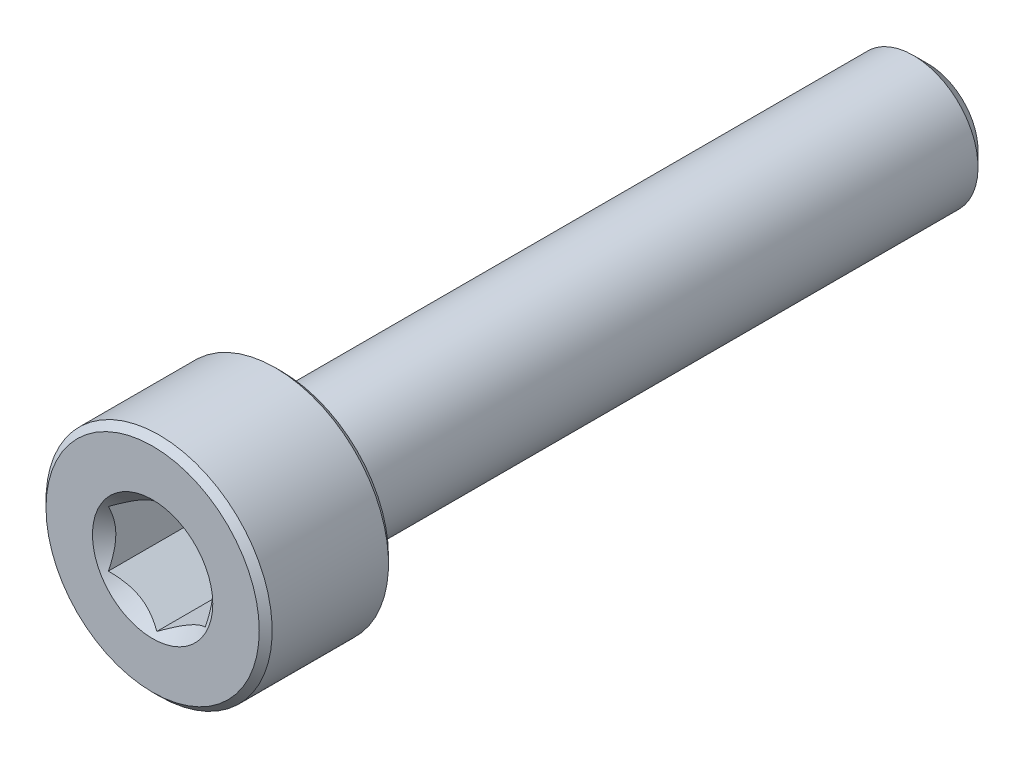
ISO-10303-21;
HEADER;
FILE_DESCRIPTION(('STEP AP214'),'2;1');
FILE_NAME('part.step','',(''),(''),'','','');
FILE_SCHEMA(('AUTOMOTIVE_DESIGN { 1 0 10303 214 1 1 1 1 }'));
ENDSEC;
DATA;
#1=APPLICATION_CONTEXT('core data for automotive mechanical design processes');
#2=APPLICATION_PROTOCOL_DEFINITION('international standard','automotive_design',2000,#1);
#3=PRODUCT_CONTEXT('',#1,'mechanical');
#4=PRODUCT('Part','Part','',(#3));
#5=PRODUCT_RELATED_PRODUCT_CATEGORY('part','',(#4));
#6=PRODUCT_DEFINITION_FORMATION('','',#4);
#7=PRODUCT_DEFINITION_CONTEXT('part definition',#1,'design');
#8=PRODUCT_DEFINITION('design','',#6,#7);
#9=PRODUCT_DEFINITION_SHAPE('','',#8);
#10=(LENGTH_UNIT() NAMED_UNIT(*) SI_UNIT(.MILLI.,.METRE.));
#11=(NAMED_UNIT(*) PLANE_ANGLE_UNIT() SI_UNIT($,.RADIAN.));
#12=(NAMED_UNIT(*) SI_UNIT($,.STERADIAN.) SOLID_ANGLE_UNIT());
#13=UNCERTAINTY_MEASURE_WITH_UNIT(LENGTH_MEASURE(1.E-05),#10,'distance_accuracy_value','');
#14=(GEOMETRIC_REPRESENTATION_CONTEXT(3) GLOBAL_UNCERTAINTY_ASSIGNED_CONTEXT((#13)) GLOBAL_UNIT_ASSIGNED_CONTEXT((#10,
#11,#12)) REPRESENTATION_CONTEXT('',''));
#15=CARTESIAN_POINT('',(0.,0.,0.));
#16=DIRECTION('',(0.,0.,1.));
#17=DIRECTION('',(1.,0.,0.));
#18=AXIS2_PLACEMENT_3D('',#15,#16,#17);
#19=CARTESIAN_POINT('',(0.,1.54533666301317,-12.));
#20=DIRECTION('',(0.,0.,-1.));
#21=DIRECTION('',(0.,1.,0.));
#22=AXIS2_PLACEMENT_3D('',#19,#20,#21);
#23=PLANE('',#22);
#24=CARTESIAN_POINT('',(0.,0.,-12.));
#25=DIRECTION('',(0.,0.,-1.));
#26=DIRECTION('',(0.,1.,0.));
#27=AXIS2_PLACEMENT_3D('',#24,#25,#26);
#28=CIRCLE('',#27,1.54533666301317);
#29=CARTESIAN_POINT('',(0.,1.54533666301317,-12.));
#30=VERTEX_POINT('',#29);
#31=EDGE_CURVE('E52',#30,#30,#28,.T.);
#32=ORIENTED_EDGE('',*,*,#31,.T.);
#33=EDGE_LOOP('',(#32));
#34=FACE_BOUND('',#33,.T.);
#35=ADVANCED_FACE('F39',(#34),#23,.T.);
#36=CARTESIAN_POINT('',(0.,0.,-12.));
#37=DIRECTION('',(0.,0.,1.));
#38=DIRECTION('',(0.,-1.,0.));
#39=AXIS2_PLACEMENT_3D('',#36,#37,#38);
#40=CONICAL_SURFACE('',#39,1.54533666301317,0.785398163397447);
#41=CARTESIAN_POINT('',(0.,0.,-11.5453366630132));
#42=DIRECTION('',(0.,0.,-1.));
#43=DIRECTION('',(0.,1.,0.));
#44=AXIS2_PLACEMENT_3D('',#41,#42,#43);
#45=CIRCLE('',#44,2.);
#46=CARTESIAN_POINT('',(0.,2.,-11.5453366630132));
#47=VERTEX_POINT('',#46);
#48=EDGE_CURVE('E155',#47,#47,#45,.T.);
#49=ORIENTED_EDGE('',*,*,#48,.T.);
#50=EDGE_LOOP('',(#49));
#51=FACE_BOUND('',#50,.T.);
#52=ORIENTED_EDGE('',*,*,#31,.F.);
#53=EDGE_LOOP('',(#52));
#54=FACE_BOUND('',#53,.T.);
#55=ADVANCED_FACE('F161',(#51,#54),#40,.T.);
#56=CARTESIAN_POINT('',(0.,0.,-12.));
#57=DIRECTION('',(0.,0.,-1.));
#58=DIRECTION('',(0.,1.,0.));
#59=AXIS2_PLACEMENT_3D('',#56,#57,#58);
#60=CYLINDRICAL_SURFACE('',#59,2.);
#61=CARTESIAN_POINT('',(0.,0.,7.8));
#62=DIRECTION('',(0.,0.,-1.));
#63=DIRECTION('',(0.,1.,0.));
#64=AXIS2_PLACEMENT_3D('',#61,#62,#63);
#65=CIRCLE('',#64,2.);
#66=CARTESIAN_POINT('',(0.,2.,7.8));
#67=VERTEX_POINT('',#66);
#68=EDGE_CURVE('E152',#67,#67,#65,.T.);
#69=ORIENTED_EDGE('',*,*,#68,.T.);
#70=EDGE_LOOP('',(#69));
#71=FACE_BOUND('',#70,.T.);
#72=ORIENTED_EDGE('',*,*,#48,.F.);
#73=EDGE_LOOP('',(#72));
#74=FACE_BOUND('',#73,.T.);
#75=ADVANCED_FACE('F163',(#71,#74),#60,.T.);
#76=CARTESIAN_POINT('',(0.,0.,7.8));
#77=DIRECTION('',(0.,0.,-1.));
#78=DIRECTION('',(0.,1.,0.));
#79=AXIS2_PLACEMENT_3D('',#76,#77,#78);
#80=TOROIDAL_SURFACE('',#79,2.2,0.2);
#81=CARTESIAN_POINT('',(0.,0.,8.));
#82=DIRECTION('',(0.,0.,-1.));
#83=DIRECTION('',(0.,1.,0.));
#84=AXIS2_PLACEMENT_3D('',#81,#82,#83);
#85=CIRCLE('',#84,2.2);
#86=CARTESIAN_POINT('',(0.,2.2,8.));
#87=VERTEX_POINT('',#86);
#88=EDGE_CURVE('E149',#87,#87,#85,.T.);
#89=ORIENTED_EDGE('',*,*,#88,.T.);
#90=EDGE_LOOP('',(#89));
#91=FACE_BOUND('',#90,.T.);
#92=ORIENTED_EDGE('',*,*,#68,.F.);
#93=EDGE_LOOP('',(#92));
#94=FACE_BOUND('',#93,.T.);
#95=ADVANCED_FACE('F169',(#91,#94),#80,.F.);
#96=CARTESIAN_POINT('',(0.,3.3,8.));
#97=DIRECTION('',(0.,0.,-1.));
#98=DIRECTION('',(0.,1.,0.));
#99=AXIS2_PLACEMENT_3D('',#96,#97,#98);
#100=PLANE('',#99);
#101=CARTESIAN_POINT('',(0.,0.,8.));
#102=DIRECTION('',(0.,0.,-1.));
#103=DIRECTION('',(0.,1.,0.));
#104=AXIS2_PLACEMENT_3D('',#101,#102,#103);
#105=CIRCLE('',#104,3.3);
#106=CARTESIAN_POINT('',(0.,3.3,8.));
#107=VERTEX_POINT('',#106);
#108=EDGE_CURVE('E146',#107,#107,#105,.T.);
#109=ORIENTED_EDGE('',*,*,#108,.T.);
#110=EDGE_LOOP('',(#109));
#111=FACE_BOUND('',#110,.T.);
#112=ORIENTED_EDGE('',*,*,#88,.F.);
#113=EDGE_LOOP('',(#112));
#114=FACE_BOUND('',#113,.T.);
#115=ADVANCED_FACE('F175',(#111,#114),#100,.T.);
#116=CARTESIAN_POINT('',(0.,0.,8.));
#117=DIRECTION('',(0.,0.,1.));
#118=DIRECTION('',(0.,-1.,0.));
#119=AXIS2_PLACEMENT_3D('',#116,#117,#118);
#120=CONICAL_SURFACE('',#119,3.3,0.785398163397443);
#121=CARTESIAN_POINT('',(0.,0.,8.2));
#122=DIRECTION('',(0.,0.,-1.));
#123=DIRECTION('',(0.,1.,0.));
#124=AXIS2_PLACEMENT_3D('',#121,#122,#123);
#125=CIRCLE('',#124,3.5);
#126=CARTESIAN_POINT('',(0.,3.5,8.2));
#127=VERTEX_POINT('',#126);
#128=EDGE_CURVE('E143',#127,#127,#125,.T.);
#129=ORIENTED_EDGE('',*,*,#128,.T.);
#130=EDGE_LOOP('',(#129));
#131=FACE_BOUND('',#130,.T.);
#132=ORIENTED_EDGE('',*,*,#108,.F.);
#133=EDGE_LOOP('',(#132));
#134=FACE_BOUND('',#133,.T.);
#135=ADVANCED_FACE('F179',(#131,#134),#120,.T.);
#136=CARTESIAN_POINT('',(0.,0.,-12.));
#137=DIRECTION('',(0.,0.,-1.));
#138=DIRECTION('',(0.,1.,0.));
#139=AXIS2_PLACEMENT_3D('',#136,#137,#138);
#140=CYLINDRICAL_SURFACE('',#139,3.5);
#141=CARTESIAN_POINT('',(0.,0.,11.8));
#142=DIRECTION('',(0.,0.,-1.));
#143=DIRECTION('',(0.,1.,0.));
#144=AXIS2_PLACEMENT_3D('',#141,#142,#143);
#145=CIRCLE('',#144,3.5);
#146=CARTESIAN_POINT('',(0.,3.5,11.8));
#147=VERTEX_POINT('',#146);
#148=EDGE_CURVE('E140',#147,#147,#145,.T.);
#149=ORIENTED_EDGE('',*,*,#148,.T.);
#150=EDGE_LOOP('',(#149));
#151=FACE_BOUND('',#150,.T.);
#152=ORIENTED_EDGE('',*,*,#128,.F.);
#153=EDGE_LOOP('',(#152));
#154=FACE_BOUND('',#153,.T.);
#155=ADVANCED_FACE('F183',(#151,#154),#140,.T.);
#156=CARTESIAN_POINT('',(0.,0.,11.8));
#157=DIRECTION('',(0.,0.,-1.));
#158=DIRECTION('',(0.,1.,0.));
#159=AXIS2_PLACEMENT_3D('',#156,#157,#158);
#160=CONICAL_SURFACE('',#159,3.5,0.785398163397452);
#161=CARTESIAN_POINT('',(0.,0.,12.));
#162=DIRECTION('',(0.,0.,-1.));
#163=DIRECTION('',(0.,1.,0.));
#164=AXIS2_PLACEMENT_3D('',#161,#162,#163);
#165=CIRCLE('',#164,3.3);
#166=CARTESIAN_POINT('',(0.,3.3,12.));
#167=VERTEX_POINT('',#166);
#168=EDGE_CURVE('E137',#167,#167,#165,.T.);
#169=ORIENTED_EDGE('',*,*,#168,.T.);
#170=EDGE_LOOP('',(#169));
#171=FACE_BOUND('',#170,.T.);
#172=ORIENTED_EDGE('',*,*,#148,.F.);
#173=EDGE_LOOP('',(#172));
#174=FACE_BOUND('',#173,.T.);
#175=ADVANCED_FACE('F187',(#171,#174),#160,.T.);
#176=CARTESIAN_POINT('',(0.,0.,12.));
#177=DIRECTION('',(0.,0.,1.));
#178=DIRECTION('',(0.,-1.,0.));
#179=AXIS2_PLACEMENT_3D('',#176,#177,#178);
#180=PLANE('',#179);
#181=CARTESIAN_POINT('',(0.,0.,12.));
#182=DIRECTION('',(0.,0.,1.));
#183=DIRECTION('',(1.,0.,0.));
#184=AXIS2_PLACEMENT_3D('',#181,#182,#183);
#185=CIRCLE('',#184,1.86195461813654);
#186=CARTESIAN_POINT('',(1.86195461813654,0.,12.));
#187=VERTEX_POINT('',#186);
#188=EDGE_CURVE('E111',#187,#187,#185,.T.);
#189=ORIENTED_EDGE('',*,*,#188,.F.);
#190=EDGE_LOOP('',(#189));
#191=FACE_BOUND('',#190,.T.);
#192=ORIENTED_EDGE('',*,*,#168,.F.);
#193=EDGE_LOOP('',(#192));
#194=FACE_BOUND('',#193,.T.);
#195=ADVANCED_FACE('F191',(#191,#194),#180,.T.);
#196=CARTESIAN_POINT('',(0.,0.,12.));
#197=DIRECTION('',(0.,0.,1.));
#198=DIRECTION('',(1.,0.,0.));
#199=AXIS2_PLACEMENT_3D('',#196,#197,#198);
#200=CONICAL_SURFACE('',#199,1.86195461813654,0.78539816339745);
#201=ORIENTED_EDGE('',*,*,#188,.T.);
#202=EDGE_LOOP('',(#201));
#203=FACE_BOUND('',#202,.T.);
#204=CARTESIAN_POINT('',(-0.000199999999999267,-1.73216627762272,11.8702116710324));
#205=CARTESIAN_POINT('',(0.0513677907370761,-1.70239359975915,11.8404616654997));
#206=CARTESIAN_POINT('',(0.103797917665201,-1.67212305186355,11.8124586733426));
#207=CARTESIAN_POINT('',(0.210709034055597,-1.61039789003619,11.7611854198725));
#208=CARTESIAN_POINT('',(0.265200195814661,-1.57893740312614,11.7379436944767));
#209=CARTESIAN_POINT('',(0.375079081357248,-1.51549879897987,11.6981299184246));
#210=CARTESIAN_POINT('',(0.4304388090952,-1.4835368452681,11.6814577751032));
#211=CARTESIAN_POINT('',(0.542377257477151,-1.41890915196211,11.6557706462504));
#212=CARTESIAN_POINT('',(0.598952556553009,-1.38624538781118,11.6467364799112));
#213=CARTESIAN_POINT('',(0.696455389516441,-1.32995210095299,11.6385852706592));
#214=CARTESIAN_POINT('',(0.737256908280466,-1.30639533311124,11.6373784424216));
#215=CARTESIAN_POINT('',(0.818787969615858,-1.25932335290193,11.6394102465946));
#216=CARTESIAN_POINT('',(0.85951749431463,-1.23580815085313,11.6426498601806));
#217=CARTESIAN_POINT('',(0.940584402163416,-1.18900414978427,11.6533881754143));
#218=CARTESIAN_POINT('',(0.980921384598288,-1.1657155821172,11.6608908424511));
#219=CARTESIAN_POINT('',(1.06091833691403,-1.11952932016335,11.6797478013606));
#220=CARTESIAN_POINT('',(1.10057800851621,-1.09663179808786,11.6911037464509));
#221=CARTESIAN_POINT('',(1.20216313477448,-1.03798159809698,11.724817837025));
#222=CARTESIAN_POINT('',(1.26345855370969,-1.00259267147465,11.7497180385257));
#223=CARTESIAN_POINT('',(1.35358562846331,-0.950557780604375,11.7917528427039));
#224=CARTESIAN_POINT('',(1.38328513990772,-0.933410759677148,11.8065213429914));
#225=CARTESIAN_POINT('',(1.44213790138375,-0.899432101996407,11.8374067553725));
#226=CARTESIAN_POINT('',(1.47129140422064,-0.88260031928571,11.853523023554));
#227=CARTESIAN_POINT('',(1.5002,-0.865909933730601,11.8702116710324));
#228=B_SPLINE_CURVE_WITH_KNOTS('',3,(#204,#205,#206,#207,#208,#209,#210,#211,#212,#213,#214,
#215,#216,#217,#218,#219,#220,#221,#222,#223,#224,#225,#226,#227),.UNSPECIFIED.,.F.,.F.,(4,2,2,
2,2,2,2,2,2,2,2,4),(0.,0.199829143693304,0.400822987382388,0.59862372053818,0.795926240188888,
0.93711306795988,1.07833105577193,1.21968061668222,1.36109089931054,1.58570969637565,
1.69770705470963,1.80965120737194),.UNSPECIFIED.);
#229=CARTESIAN_POINT('',(0.,-1.73205080756888,11.8700961894323));
#230=VERTEX_POINT('',#229);
#231=CARTESIAN_POINT('',(1.5,-0.866025403784439,11.8700961894323));
#232=VERTEX_POINT('',#231);
#233=EDGE_CURVE('E12',#230,#232,#228,.T.);
#234=ORIENTED_EDGE('',*,*,#233,.F.);
#235=CARTESIAN_POINT('',(-1.5002,-0.865909933730601,11.8702116710324));
#236=CARTESIAN_POINT('',(-1.44863220926292,-0.895682611594166,11.8404616654997));
#237=CARTESIAN_POINT('',(-1.3962020823348,-0.925953159489765,11.8124586733426));
#238=CARTESIAN_POINT('',(-1.2892909659444,-0.987678321317124,11.7611854198725));
#239=CARTESIAN_POINT('',(-1.23479980418534,-1.01913880822717,11.7379436944767));
#240=CARTESIAN_POINT('',(-1.12492091864275,-1.08257741237344,11.6981299184246));
#241=CARTESIAN_POINT('',(-1.0695611909048,-1.11453936608521,11.6814577751032));
#242=CARTESIAN_POINT('',(-0.95762274252285,-1.1791670593912,11.6557706462504));
#243=CARTESIAN_POINT('',(-0.901047443446992,-1.21183082354213,11.6467364799112));
#244=CARTESIAN_POINT('',(-0.80354461048356,-1.26812411040032,11.6385852706592));
#245=CARTESIAN_POINT('',(-0.762743091719534,-1.29168087824208,11.6373784424216));
#246=CARTESIAN_POINT('',(-0.681212030384142,-1.33875285845138,11.6394102465946));
#247=CARTESIAN_POINT('',(-0.640482505685371,-1.36226806050018,11.6426498601806));
#248=CARTESIAN_POINT('',(-0.559415597836584,-1.40907206156905,11.6533881754143));
#249=CARTESIAN_POINT('',(-0.519078615401712,-1.43236062923612,11.6608908424511));
#250=CARTESIAN_POINT('',(-0.439081663085969,-1.47854689118996,11.6797478013606));
#251=CARTESIAN_POINT('',(-0.399421991483792,-1.50144441326545,11.6911037464509));
#252=CARTESIAN_POINT('',(-0.297836865225515,-1.56009461325633,11.724817837025));
#253=CARTESIAN_POINT('',(-0.236541446290311,-1.59548353987866,11.7497180385257));
#254=CARTESIAN_POINT('',(-0.146414371536686,-1.64751843074894,11.7917528427039));
#255=CARTESIAN_POINT('',(-0.116714860092282,-1.66466545167617,11.8065213429914));
#256=CARTESIAN_POINT('',(-0.0578620986162489,-1.69864410935691,11.8374067553725));
#257=CARTESIAN_POINT('',(-0.0287085957793626,-1.71547589206761,11.853523023554));
#258=CARTESIAN_POINT('',(0.000200000000000409,-1.73216627762272,11.8702116710324));
#259=B_SPLINE_CURVE_WITH_KNOTS('',3,(#235,#236,#237,#238,#239,#240,#241,#242,#243,#244,#245,
#246,#247,#248,#249,#250,#251,#252,#253,#254,#255,#256,#257,#258),.UNSPECIFIED.,.F.,.F.,(4,2,2,
2,2,2,2,2,2,2,2,4),(0.,0.199829143693304,0.400822987382388,0.59862372053818,0.795926240188888,
0.93711306795988,1.07833105577193,1.21968061668222,1.36109089931054,1.58570969637565,
1.69770705470964,1.80965120737194),.UNSPECIFIED.);
#260=CARTESIAN_POINT('',(-1.5,-0.866025403784439,11.8700961894323));
#261=VERTEX_POINT('',#260);
#262=EDGE_CURVE('E97',#261,#230,#259,.T.);
#263=ORIENTED_EDGE('',*,*,#262,.F.);
#264=CARTESIAN_POINT('',(-1.5,-1.81798631684901,12.4949658829093));
#265=CARTESIAN_POINT('',(-1.5,-1.77410479833239,12.461123354197));
#266=CARTESIAN_POINT('',(-1.5,-1.72998897047494,12.427585617689));
#267=CARTESIAN_POINT('',(-1.5,-1.64119029432319,12.3612481734927));
#268=CARTESIAN_POINT('',(-1.5,-1.59650731534755,12.328448640911));
#269=CARTESIAN_POINT('',(-1.5,-1.460806940489,12.2308819314804));
#270=CARTESIAN_POINT('',(-1.5,-1.36880251235632,12.1674654206559));
#271=CARTESIAN_POINT('',(-1.5,-1.17526237686872,12.0421023717216));
#272=CARTESIAN_POINT('',(-1.5,-1.07349393006072,11.9805114153672));
#273=CARTESIAN_POINT('',(-1.5,-0.864764842560626,11.8672522059965));
#274=CARTESIAN_POINT('',(-1.5,-0.757823334449948,11.8155504395058));
#275=CARTESIAN_POINT('',(-1.5,-0.598146069886858,11.7522731736164));
#276=CARTESIAN_POINT('',(-1.5,-0.547969945491557,11.7342740839912));
#277=CARTESIAN_POINT('',(-1.5,-0.446326869364775,11.7022954652208));
#278=CARTESIAN_POINT('',(-1.5,-0.394859836419925,11.6883161896624));
#279=CARTESIAN_POINT('',(-1.5,-0.291848397493325,11.6653656903726));
#280=CARTESIAN_POINT('',(-1.5,-0.240324749628771,11.6563028154328));
#281=CARTESIAN_POINT('',(-1.5,-0.13662544851591,11.6433771152152));
#282=CARTESIAN_POINT('',(-1.5,-0.0844499362377799,11.6395131846234));
#283=CARTESIAN_POINT('',(-1.5,0.0176806967011133,11.6373196125689));
#284=CARTESIAN_POINT('',(-1.5,0.0676307045116619,11.6387500692366));
#285=CARTESIAN_POINT('',(-1.5,0.167145477637761,11.6465133142386));
#286=CARTESIAN_POINT('',(-1.5,0.216710207908514,11.6528465433779));
#287=CARTESIAN_POINT('',(-1.5,0.315937150651982,11.6701627170715));
#288=CARTESIAN_POINT('',(-1.5,0.365584733694538,11.6812281518103));
#289=CARTESIAN_POINT('',(-1.5,0.46378160619877,11.7073934991991));
#290=CARTESIAN_POINT('',(-1.5,0.512330953840259,11.7224931975855));
#291=CARTESIAN_POINT('',(-1.5,0.66131302328769,11.7746138556917));
#292=CARTESIAN_POINT('',(-1.5,0.759720789706277,11.8174049630424));
#293=CARTESIAN_POINT('',(-1.5,0.95194266902277,11.9126388372101));
#294=CARTESIAN_POINT('',(-1.5,1.04573912191844,11.9651155264859));
#295=CARTESIAN_POINT('',(-1.5,1.22504153577549,12.0734783373155));
#296=CARTESIAN_POINT('',(-1.5,1.3107282773288,12.1290691055441));
#297=CARTESIAN_POINT('',(-1.5,1.43696960041027,12.2150504562164));
#298=CARTESIAN_POINT('',(-1.5,1.47850725450332,12.2440226829709));
#299=CARTESIAN_POINT('',(-1.5,1.56101250374723,12.3027448839378));
#300=CARTESIAN_POINT('',(-1.5,1.60198025290925,12.3324946415183));
#301=CARTESIAN_POINT('',(-1.5,1.64271029717086,12.362567155286));
#302=B_SPLINE_CURVE_WITH_KNOTS('',3,(#264,#265,#266,#267,#268,#269,#270,#271,#272,#273,#274,
#275,#276,#277,#278,#279,#280,#281,#282,#283,#284,#285,#286,#287,#288,#289,#290,#291,#292,#293,
#294,#295,#296,#297,#298,#299,#300,#301),.UNSPECIFIED.,.F.,.F.,(4,2,2,2,2,2,2,2,2,2,2,2,2,2,2,2,
2,2,4),(0.,0.166243250325254,0.332525527595493,0.667617582874063,1.02421660314856,
1.37958485991001,1.53937185590112,1.69916892971772,1.85587466130012,2.01254707142443,
2.16220898927398,2.31188436469118,2.46428258498153,2.61667271286894,2.93766301623296,
3.25979964661299,3.56606529199602,3.71798989158864,3.86987260467919),.UNSPECIFIED.);
#303=CARTESIAN_POINT('',(-1.5,0.866025403784438,11.8700961894323));
#304=VERTEX_POINT('',#303);
#305=EDGE_CURVE('E110',#304,#261,#302,.F.);
#306=ORIENTED_EDGE('',*,*,#305,.F.);
#307=CARTESIAN_POINT('',(0.000199999999999471,1.73216627762272,11.8702116710324));
#308=CARTESIAN_POINT('',(-0.0513677907370762,1.70239359975915,11.8404616654997));
#309=CARTESIAN_POINT('',(-0.103797917665201,1.67212305186355,11.8124586733426));
#310=CARTESIAN_POINT('',(-0.210709034055597,1.61039789003619,11.7611854198725));
#311=CARTESIAN_POINT('',(-0.265200195814661,1.57893740312614,11.7379436944767));
#312=CARTESIAN_POINT('',(-0.375079081357249,1.51549879897987,11.6981299184246));
#313=CARTESIAN_POINT('',(-0.4304388090952,1.4835368452681,11.6814577751032));
#314=CARTESIAN_POINT('',(-0.54237725747715,1.41890915196211,11.6557706462504));
#315=CARTESIAN_POINT('',(-0.598952556553008,1.38624538781118,11.6467364799112));
#316=CARTESIAN_POINT('',(-0.69645538951644,1.329952100953,11.6385852706592));
#317=CARTESIAN_POINT('',(-0.737256908280466,1.30639533311124,11.6373784424216));
#318=CARTESIAN_POINT('',(-0.818787969615858,1.25932335290194,11.6394102465946));
#319=CARTESIAN_POINT('',(-0.859517494314629,1.23580815085313,11.6426498601806));
#320=CARTESIAN_POINT('',(-0.940584402163415,1.18900414978427,11.6533881754143));
#321=CARTESIAN_POINT('',(-0.980921384598287,1.1657155821172,11.6608908424511));
#322=CARTESIAN_POINT('',(-1.06091833691403,1.11952932016335,11.6797478013606));
#323=CARTESIAN_POINT('',(-1.10057800851621,1.09663179808786,11.6911037464509));
#324=CARTESIAN_POINT('',(-1.20216313477448,1.03798159809698,11.724817837025));
#325=CARTESIAN_POINT('',(-1.26345855370969,1.00259267147465,11.7497180385257));
#326=CARTESIAN_POINT('',(-1.35358562846331,0.950557780604375,11.7917528427039));
#327=CARTESIAN_POINT('',(-1.38328513990772,0.933410759677147,11.8065213429914));
#328=CARTESIAN_POINT('',(-1.44213790138375,0.899432101996407,11.8374067553725));
#329=CARTESIAN_POINT('',(-1.47129140422064,0.88260031928571,11.853523023554));
#330=CARTESIAN_POINT('',(-1.5002,0.8659099337306,11.8702116710324));
#331=B_SPLINE_CURVE_WITH_KNOTS('',3,(#307,#308,#309,#310,#311,#312,#313,#314,#315,#316,#317,
#318,#319,#320,#321,#322,#323,#324,#325,#326,#327,#328,#329,#330),.UNSPECIFIED.,.F.,.F.,(4,2,2,
2,2,2,2,2,2,2,2,4),(0.,0.199829143693305,0.400822987382388,0.59862372053818,0.795926240188888,
0.93711306795988,1.07833105577193,1.21968061668222,1.36109089931054,1.58570969637565,
1.69770705470964,1.80965120737194),.UNSPECIFIED.);
#332=CARTESIAN_POINT('',(0.,1.73205080756888,11.8700961894323));
#333=VERTEX_POINT('',#332);
#334=EDGE_CURVE('E241',#333,#304,#331,.T.);
#335=ORIENTED_EDGE('',*,*,#334,.F.);
#336=CARTESIAN_POINT('',(1.5002,0.865909933730601,11.8702116710324));
#337=CARTESIAN_POINT('',(1.44863220926292,0.895682611594166,11.8404616654997));
#338=CARTESIAN_POINT('',(1.3962020823348,0.925953159489765,11.8124586733426));
#339=CARTESIAN_POINT('',(1.2892909659444,0.987678321317124,11.7611854198725));
#340=CARTESIAN_POINT('',(1.23479980418534,1.01913880822718,11.7379436944767));
#341=CARTESIAN_POINT('',(1.12492091864275,1.08257741237344,11.6981299184246));
#342=CARTESIAN_POINT('',(1.0695611909048,1.11453936608521,11.6814577751032));
#343=CARTESIAN_POINT('',(0.957622742522849,1.1791670593912,11.6557706462504));
#344=CARTESIAN_POINT('',(0.901047443446992,1.21183082354213,11.6467364799112));
#345=CARTESIAN_POINT('',(0.803544610483559,1.26812411040032,11.6385852706592));
#346=CARTESIAN_POINT('',(0.762743091719534,1.29168087824208,11.6373784424216));
#347=CARTESIAN_POINT('',(0.681212030384142,1.33875285845138,11.6394102465946));
#348=CARTESIAN_POINT('',(0.64048250568537,1.36226806050018,11.6426498601806));
#349=CARTESIAN_POINT('',(0.559415597836584,1.40907206156905,11.6533881754143));
#350=CARTESIAN_POINT('',(0.519078615401712,1.43236062923612,11.6608908424511));
#351=CARTESIAN_POINT('',(0.439081663085969,1.47854689118996,11.6797478013606));
#352=CARTESIAN_POINT('',(0.399421991483792,1.50144441326545,11.6911037464509));
#353=CARTESIAN_POINT('',(0.297836865225515,1.56009461325633,11.724817837025));
#354=CARTESIAN_POINT('',(0.236541446290311,1.59548353987866,11.7497180385257));
#355=CARTESIAN_POINT('',(0.146414371536687,1.64751843074894,11.7917528427039));
#356=CARTESIAN_POINT('',(0.116714860092282,1.66466545167617,11.8065213429914));
#357=CARTESIAN_POINT('',(0.0578620986162492,1.69864410935691,11.8374067553725));
#358=CARTESIAN_POINT('',(0.0287085957793629,1.71547589206761,11.853523023554));
#359=CARTESIAN_POINT('',(-0.000200000000000123,1.73216627762272,11.8702116710324));
#360=B_SPLINE_CURVE_WITH_KNOTS('',3,(#336,#337,#338,#339,#340,#341,#342,#343,#344,#345,#346,
#347,#348,#349,#350,#351,#352,#353,#354,#355,#356,#357,#358,#359),.UNSPECIFIED.,.F.,.F.,(4,2,2,
2,2,2,2,2,2,2,2,4),(0.,0.199829143693305,0.400822987382389,0.598623720538181,0.795926240188889,
0.937113067959881,1.07833105577193,1.21968061668222,1.36109089931054,1.58570969637565,
1.69770705470964,1.80965120737194),.UNSPECIFIED.);
#361=CARTESIAN_POINT('',(1.5,0.866025403784439,11.8700961894323));
#362=VERTEX_POINT('',#361);
#363=EDGE_CURVE('E214',#362,#333,#360,.T.);
#364=ORIENTED_EDGE('',*,*,#363,.F.);
#365=CARTESIAN_POINT('',(1.5,-1.81798631684901,12.4949658829093));
#366=CARTESIAN_POINT('',(1.5,-1.77410479833238,12.461123354197));
#367=CARTESIAN_POINT('',(1.5,-1.72998897047494,12.427585617689));
#368=CARTESIAN_POINT('',(1.5,-1.64119029432319,12.3612481734927));
#369=CARTESIAN_POINT('',(1.5,-1.59650731534755,12.328448640911));
#370=CARTESIAN_POINT('',(1.5,-1.460806940489,12.2308819314804));
#371=CARTESIAN_POINT('',(1.5,-1.36880251235632,12.1674654206559));
#372=CARTESIAN_POINT('',(1.5,-1.17526237686872,12.0421023717216));
#373=CARTESIAN_POINT('',(1.5,-1.07349393006072,11.9805114153672));
#374=CARTESIAN_POINT('',(1.5,-0.864764842560626,11.8672522059965));
#375=CARTESIAN_POINT('',(1.5,-0.757823334449948,11.8155504395058));
#376=CARTESIAN_POINT('',(1.5,-0.598146069886857,11.7522731736164));
#377=CARTESIAN_POINT('',(1.5,-0.547969945491556,11.7342740839912));
#378=CARTESIAN_POINT('',(1.5,-0.446326869364773,11.7022954652208));
#379=CARTESIAN_POINT('',(1.5,-0.394859836419924,11.6883161896624));
#380=CARTESIAN_POINT('',(1.5,-0.291848397493324,11.6653656903726));
#381=CARTESIAN_POINT('',(1.5,-0.24032474962877,11.6563028154328));
#382=CARTESIAN_POINT('',(1.5,-0.13662544851591,11.6433771152152));
#383=CARTESIAN_POINT('',(1.5,-0.0844499362377794,11.6395131846234));
#384=CARTESIAN_POINT('',(1.5,0.0176806967011135,11.6373196125689));
#385=CARTESIAN_POINT('',(1.5,0.067630704511662,11.6387500692366));
#386=CARTESIAN_POINT('',(1.5,0.167145477637761,11.6465133142386));
#387=CARTESIAN_POINT('',(1.5,0.216710207908514,11.6528465433779));
#388=CARTESIAN_POINT('',(1.5,0.315937150651983,11.6701627170715));
#389=CARTESIAN_POINT('',(1.5,0.365584733694539,11.6812281518103));
#390=CARTESIAN_POINT('',(1.5,0.46378160619877,11.7073934991991));
#391=CARTESIAN_POINT('',(1.5,0.51233095384026,11.7224931975855));
#392=CARTESIAN_POINT('',(1.5,0.661313023287691,11.7746138556917));
#393=CARTESIAN_POINT('',(1.5,0.759720789706278,11.8174049630424));
#394=CARTESIAN_POINT('',(1.5,0.951942669022772,11.9126388372101));
#395=CARTESIAN_POINT('',(1.5,1.04573912191844,11.965115526486));
#396=CARTESIAN_POINT('',(1.5,1.22504153577549,12.0734783373155));
#397=CARTESIAN_POINT('',(1.5,1.3107282773288,12.1290691055441));
#398=CARTESIAN_POINT('',(1.5,1.43696960041028,12.2150504562164));
#399=CARTESIAN_POINT('',(1.5,1.47850725450332,12.2440226829709));
#400=CARTESIAN_POINT('',(1.5,1.56101250374723,12.3027448839378));
#401=CARTESIAN_POINT('',(1.5,1.60198025290925,12.3324946415183));
#402=CARTESIAN_POINT('',(1.5,1.64271029717086,12.362567155286));
#403=B_SPLINE_CURVE_WITH_KNOTS('',3,(#365,#366,#367,#368,#369,#370,#371,#372,#373,#374,#375,
#376,#377,#378,#379,#380,#381,#382,#383,#384,#385,#386,#387,#388,#389,#390,#391,#392,#393,#394,
#395,#396,#397,#398,#399,#400,#401,#402),.UNSPECIFIED.,.F.,.F.,(4,2,2,2,2,2,2,2,2,2,2,2,2,2,2,2,
2,2,4),(0.,0.166243250325254,0.332525527595493,0.667617582874063,1.02421660314856,
1.37958485991001,1.53937185590113,1.69916892971772,1.85587466130012,2.01254707142443,
2.16220898927398,2.31188436469118,2.46428258498153,2.61667271286894,2.93766301623296,
3.25979964661299,3.56606529199603,3.71798989158865,3.86987260467919),.UNSPECIFIED.);
#404=EDGE_CURVE('E59',#232,#362,#403,.T.);
#405=ORIENTED_EDGE('',*,*,#404,.F.);
#406=EDGE_LOOP('',(#234,#263,#306,#335,#364,#405));
#407=FACE_BOUND('',#406,.T.);
#408=ADVANCED_FACE('F96',(#203,#407),#200,.F.);
#409=CARTESIAN_POINT('',(0.,3.3,9.));
#410=DIRECTION('',(0.,0.,-1.));
#411=DIRECTION('',(0.,1.,0.));
#412=AXIS2_PLACEMENT_3D('',#409,#410,#411);
#413=PLANE('',#412);
#414=DIRECTION('',(0.866025403784438,0.5,0.));
#415=VECTOR('',#414,1.);
#416=CARTESIAN_POINT('',(0.,-1.73205080756888,9.));
#417=LINE('',#416,#415);
#418=CARTESIAN_POINT('',(0.,-1.73205080756888,9.));
#419=VERTEX_POINT('',#418);
#420=CARTESIAN_POINT('',(1.5,-0.866025403784439,9.));
#421=VERTEX_POINT('',#420);
#422=EDGE_CURVE('E114',#419,#421,#417,.T.);
#423=ORIENTED_EDGE('',*,*,#422,.T.);
#424=DIRECTION('',(0.,1.,0.));
#425=VECTOR('',#424,1.);
#426=CARTESIAN_POINT('',(1.5,-0.866025403784439,9.));
#427=LINE('',#426,#425);
#428=CARTESIAN_POINT('',(1.5,0.866025403784439,9.));
#429=VERTEX_POINT('',#428);
#430=EDGE_CURVE('E66',#421,#429,#427,.T.);
#431=ORIENTED_EDGE('',*,*,#430,.T.);
#432=DIRECTION('',(-0.866025403784439,0.5,0.));
#433=VECTOR('',#432,1.);
#434=CARTESIAN_POINT('',(1.5,0.866025403784439,9.));
#435=LINE('',#434,#433);
#436=CARTESIAN_POINT('',(0.,1.73205080756888,9.));
#437=VERTEX_POINT('',#436);
#438=EDGE_CURVE('E122',#429,#437,#435,.T.);
#439=ORIENTED_EDGE('',*,*,#438,.T.);
#440=DIRECTION('',(-0.866025403784439,-0.5,0.));
#441=VECTOR('',#440,1.);
#442=CARTESIAN_POINT('',(0.,1.73205080756888,9.));
#443=LINE('',#442,#441);
#444=CARTESIAN_POINT('',(-1.5,0.866025403784439,9.));
#445=VERTEX_POINT('',#444);
#446=EDGE_CURVE('E129',#437,#445,#443,.T.);
#447=ORIENTED_EDGE('',*,*,#446,.T.);
#448=DIRECTION('',(0.,-1.,0.));
#449=VECTOR('',#448,1.);
#450=CARTESIAN_POINT('',(-1.5,0.866025403784438,9.));
#451=LINE('',#450,#449);
#452=CARTESIAN_POINT('',(-1.5,-0.866025403784439,9.));
#453=VERTEX_POINT('',#452);
#454=EDGE_CURVE('E125',#445,#453,#451,.T.);
#455=ORIENTED_EDGE('',*,*,#454,.T.);
#456=DIRECTION('',(0.866025403784439,-0.5,0.));
#457=VECTOR('',#456,1.);
#458=CARTESIAN_POINT('',(-1.5,-0.866025403784439,9.));
#459=LINE('',#458,#457);
#460=EDGE_CURVE('E115',#453,#419,#459,.T.);
#461=ORIENTED_EDGE('',*,*,#460,.T.);
#462=EDGE_LOOP('',(#423,#431,#439,#447,#455,#461));
#463=FACE_BOUND('',#462,.T.);
#464=ADVANCED_FACE('F196',(#463),#413,.F.);
#465=CARTESIAN_POINT('',(0.,-1.73205080756888,3.41742430504416));
#466=DIRECTION('',(0.5,-0.866025403784438,0.));
#467=DIRECTION('',(0.866025403784438,0.5,0.));
#468=AXIS2_PLACEMENT_3D('',#465,#466,#467);
#469=PLANE('',#468);
#470=DIRECTION('',(0.,0.,1.));
#471=VECTOR('',#470,1.);
#472=CARTESIAN_POINT('',(0.,-1.73205080756888,3.41742430504416));
#473=LINE('',#472,#471);
#474=EDGE_CURVE('E106',#419,#230,#473,.T.);
#475=ORIENTED_EDGE('',*,*,#474,.T.);
#476=ORIENTED_EDGE('',*,*,#233,.T.);
#477=DIRECTION('',(0.,0.,1.));
#478=VECTOR('',#477,1.);
#479=CARTESIAN_POINT('',(1.5,-0.866025403784439,3.41742430504416));
#480=LINE('',#479,#478);
#481=EDGE_CURVE('E117',#421,#232,#480,.T.);
#482=ORIENTED_EDGE('',*,*,#481,.F.);
#483=ORIENTED_EDGE('',*,*,#422,.F.);
#484=EDGE_LOOP('',(#475,#476,#482,#483));
#485=FACE_BOUND('',#484,.T.);
#486=ADVANCED_FACE('F113',(#485),#469,.F.);
#487=CARTESIAN_POINT('',(-1.5,-0.866025403784439,3.41742430504416));
#488=DIRECTION('',(-0.5,-0.866025403784439,0.));
#489=DIRECTION('',(0.866025403784439,-0.5,0.));
#490=AXIS2_PLACEMENT_3D('',#487,#488,#489);
#491=PLANE('',#490);
#492=DIRECTION('',(0.,0.,1.));
#493=VECTOR('',#492,1.);
#494=CARTESIAN_POINT('',(-1.5,-0.866025403784439,3.41742430504416));
#495=LINE('',#494,#493);
#496=EDGE_CURVE('E109',#453,#261,#495,.T.);
#497=ORIENTED_EDGE('',*,*,#496,.T.);
#498=ORIENTED_EDGE('',*,*,#262,.T.);
#499=ORIENTED_EDGE('',*,*,#474,.F.);
#500=ORIENTED_EDGE('',*,*,#460,.F.);
#501=EDGE_LOOP('',(#497,#498,#499,#500));
#502=FACE_BOUND('',#501,.T.);
#503=ADVANCED_FACE('F105',(#502),#491,.F.);
#504=CARTESIAN_POINT('',(-1.5,0.866025403784438,3.41742430504416));
#505=DIRECTION('',(-1.,0.,0.));
#506=DIRECTION('',(0.,0.,1.));
#507=AXIS2_PLACEMENT_3D('',#504,#505,#506);
#508=PLANE('',#507);
#509=DIRECTION('',(0.,0.,1.));
#510=VECTOR('',#509,1.);
#511=CARTESIAN_POINT('',(-1.5,0.866025403784438,3.41742430504416));
#512=LINE('',#511,#510);
#513=EDGE_CURVE('E126',#445,#304,#512,.T.);
#514=ORIENTED_EDGE('',*,*,#513,.T.);
#515=ORIENTED_EDGE('',*,*,#305,.T.);
#516=ORIENTED_EDGE('',*,*,#496,.F.);
#517=ORIENTED_EDGE('',*,*,#454,.F.);
#518=EDGE_LOOP('',(#514,#515,#516,#517));
#519=FACE_BOUND('',#518,.T.);
#520=ADVANCED_FACE('F250',(#519),#508,.F.);
#521=CARTESIAN_POINT('',(0.,1.73205080756888,3.41742430504416));
#522=DIRECTION('',(-0.5,0.866025403784438,0.));
#523=DIRECTION('',(-0.866025403784439,-0.5,0.));
#524=AXIS2_PLACEMENT_3D('',#521,#522,#523);
#525=PLANE('',#524);
#526=DIRECTION('',(0.,0.,1.));
#527=VECTOR('',#526,1.);
#528=CARTESIAN_POINT('',(0.,1.73205080756888,3.41742430504416));
#529=LINE('',#528,#527);
#530=EDGE_CURVE('E130',#437,#333,#529,.T.);
#531=ORIENTED_EDGE('',*,*,#530,.T.);
#532=ORIENTED_EDGE('',*,*,#334,.T.);
#533=ORIENTED_EDGE('',*,*,#513,.F.);
#534=ORIENTED_EDGE('',*,*,#446,.F.);
#535=EDGE_LOOP('',(#531,#532,#533,#534));
#536=FACE_BOUND('',#535,.T.);
#537=ADVANCED_FACE('F247',(#536),#525,.F.);
#538=CARTESIAN_POINT('',(1.5,0.866025403784439,3.41742430504416));
#539=DIRECTION('',(0.5,0.866025403784439,0.));
#540=DIRECTION('',(-0.866025403784439,0.5,0.));
#541=AXIS2_PLACEMENT_3D('',#538,#539,#540);
#542=PLANE('',#541);
#543=DIRECTION('',(0.,0.,1.));
#544=VECTOR('',#543,1.);
#545=CARTESIAN_POINT('',(1.5,0.866025403784439,3.41742430504416));
#546=LINE('',#545,#544);
#547=EDGE_CURVE('E133',#429,#362,#546,.T.);
#548=ORIENTED_EDGE('',*,*,#547,.T.);
#549=ORIENTED_EDGE('',*,*,#363,.T.);
#550=ORIENTED_EDGE('',*,*,#530,.F.);
#551=ORIENTED_EDGE('',*,*,#438,.F.);
#552=EDGE_LOOP('',(#548,#549,#550,#551));
#553=FACE_BOUND('',#552,.T.);
#554=ADVANCED_FACE('F204',(#553),#542,.F.);
#555=CARTESIAN_POINT('',(1.5,-0.866025403784439,3.41742430504416));
#556=DIRECTION('',(1.,0.,0.));
#557=DIRECTION('',(0.,0.,-1.));
#558=AXIS2_PLACEMENT_3D('',#555,#556,#557);
#559=PLANE('',#558);
#560=ORIENTED_EDGE('',*,*,#481,.T.);
#561=ORIENTED_EDGE('',*,*,#404,.T.);
#562=ORIENTED_EDGE('',*,*,#547,.F.);
#563=ORIENTED_EDGE('',*,*,#430,.F.);
#564=EDGE_LOOP('',(#560,#561,#562,#563));
#565=FACE_BOUND('',#564,.T.);
#566=ADVANCED_FACE('F200',(#565),#559,.F.);
#567=CLOSED_SHELL('',(#35,#55,#75,#95,#115,#135,#155,#175,#195,#408,#464,#486,#503,#520,#537,
#554,#566));
#568=MANIFOLD_SOLID_BREP('B2',#567);
#569=ADVANCED_BREP_SHAPE_REPRESENTATION('',(#18,#568),#14);
#570=SHAPE_DEFINITION_REPRESENTATION(#9,#569);
ENDSEC;
END-ISO-10303-21;
